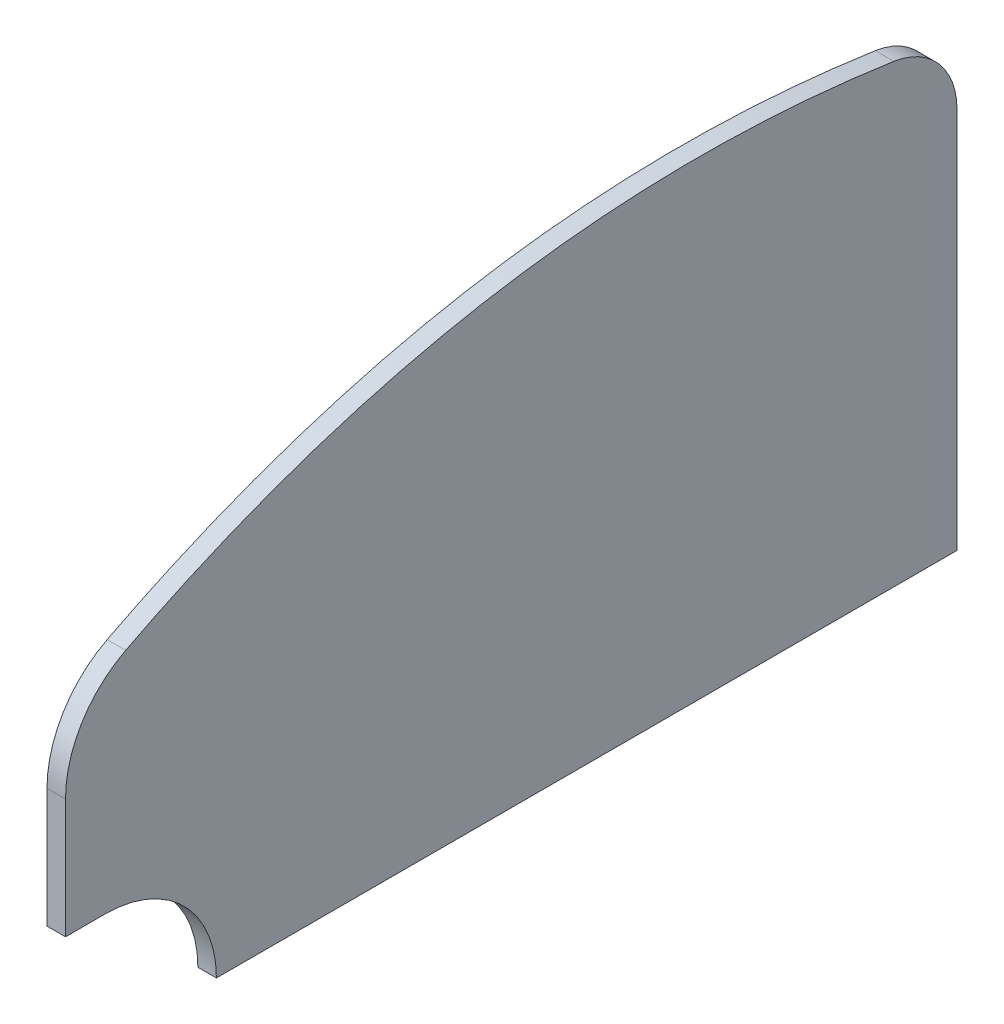
ISO-10303-21;
HEADER;
FILE_DESCRIPTION(('STEP AP214'),'2;1');
FILE_NAME('part.step','',(''),(''),'','','');
FILE_SCHEMA(('AUTOMOTIVE_DESIGN { 1 0 10303 214 1 1 1 1 }'));
ENDSEC;
DATA;
#1=APPLICATION_CONTEXT('core data for automotive mechanical design processes');
#2=APPLICATION_PROTOCOL_DEFINITION('international standard','automotive_design',2000,#1);
#3=PRODUCT_CONTEXT('',#1,'mechanical');
#4=PRODUCT('Part','Part','',(#3));
#5=PRODUCT_RELATED_PRODUCT_CATEGORY('part','',(#4));
#6=PRODUCT_DEFINITION_FORMATION('','',#4);
#7=PRODUCT_DEFINITION_CONTEXT('part definition',#1,'design');
#8=PRODUCT_DEFINITION('design','',#6,#7);
#9=PRODUCT_DEFINITION_SHAPE('','',#8);
#10=(LENGTH_UNIT() NAMED_UNIT(*) SI_UNIT(.MILLI.,.METRE.));
#11=(NAMED_UNIT(*) PLANE_ANGLE_UNIT() SI_UNIT($,.RADIAN.));
#12=(NAMED_UNIT(*) SI_UNIT($,.STERADIAN.) SOLID_ANGLE_UNIT());
#13=UNCERTAINTY_MEASURE_WITH_UNIT(LENGTH_MEASURE(1.E-05),#10,'distance_accuracy_value','');
#14=(GEOMETRIC_REPRESENTATION_CONTEXT(3) GLOBAL_UNCERTAINTY_ASSIGNED_CONTEXT((#13)) GLOBAL_UNIT_ASSIGNED_CONTEXT((#10,
#11,#12)) REPRESENTATION_CONTEXT('',''));
#15=CARTESIAN_POINT('',(0.,0.,0.));
#16=DIRECTION('',(0.,0.,1.));
#17=DIRECTION('',(1.,0.,0.));
#18=AXIS2_PLACEMENT_3D('',#15,#16,#17);
#19=CARTESIAN_POINT('',(12.7,202.565517241379,-552.210163248103));
#20=CARTESIAN_POINT('',(12.7,265.702079644609,-225.141214240864));
#21=CARTESIAN_POINT('',(12.7,100.965517241379,59.3103448275861));
#22=B_SPLINE_CURVE_WITH_KNOTS('',2,(#19,#20,#21),.UNSPECIFIED.,.F.,.F.,(3,3),(0.,1.),.UNSPECIFIED.);
#23=DIRECTION('',(-1.,0.,0.));
#24=VECTOR('',#23,1.);
#25=SURFACE_OF_LINEAR_EXTRUSION('',#22,#24);
#26=CARTESIAN_POINT('',(12.7,209.963001157048,-508.844165717423));
#27=VERTEX_POINT('',#26);
#28=CARTESIAN_POINT('',(12.7,123.552335287237,18.0391226451844));
#29=VERTEX_POINT('',#28);
#30=EDGE_CURVE('E109',#27,#29,#22,.T.);
#31=ORIENTED_EDGE('',*,*,#30,.F.);
#32=DIRECTION('',(-1.,0.,0.));
#33=VECTOR('',#32,1.);
#34=CARTESIAN_POINT('',(12.7,209.963001157048,-508.844165717423));
#35=LINE('',#34,#33);
#36=CARTESIAN_POINT('',(0.,209.963001157048,-508.844165717423));
#37=VERTEX_POINT('',#36);
#38=EDGE_CURVE('E164',#27,#37,#35,.T.);
#39=ORIENTED_EDGE('',*,*,#38,.T.);
#40=CARTESIAN_POINT('',(0.,202.565517241379,-552.210163248103));
#41=CARTESIAN_POINT('',(0.,265.702079644609,-225.141214240864));
#42=CARTESIAN_POINT('',(0.,100.965517241379,59.3103448275861));
#43=B_SPLINE_CURVE_WITH_KNOTS('',2,(#40,#41,#42),.UNSPECIFIED.,.F.,.F.,(3,3),(0.,1.),.UNSPECIFIED.);
#44=CARTESIAN_POINT('',(0.,123.552335287237,18.0391226451844));
#45=VERTEX_POINT('',#44);
#46=EDGE_CURVE('E134',#37,#45,#43,.T.);
#47=ORIENTED_EDGE('',*,*,#46,.T.);
#48=DIRECTION('',(-1.,0.,0.));
#49=VECTOR('',#48,1.);
#50=CARTESIAN_POINT('',(0.,123.552335287237,18.0391226451844));
#51=LINE('',#50,#49);
#52=EDGE_CURVE('E160',#45,#29,#51,.F.);
#53=ORIENTED_EDGE('',*,*,#52,.T.);
#54=EDGE_LOOP('',(#31,#39,#47,#53));
#55=FACE_BOUND('',#54,.T.);
#56=ADVANCED_FACE('F34',(#55),#25,.F.);
#57=CARTESIAN_POINT('',(12.7,100.965517241379,59.3103448275861));
#58=DIRECTION('',(0.,0.,-1.));
#59=DIRECTION('',(0.,1.,0.));
#60=AXIS2_PLACEMENT_3D('',#57,#58,#59);
#61=PLANE('',#60);
#62=DIRECTION('',(0.,-1.,0.));
#63=VECTOR('',#62,1.);
#64=CARTESIAN_POINT('',(12.7,100.965517241379,59.3103448275861));
#65=LINE('',#64,#63);
#66=CARTESIAN_POINT('',(12.7,55.8292189962032,59.3103448275861));
#67=VERTEX_POINT('',#66);
#68=CARTESIAN_POINT('',(12.7,-26.0344827586206,59.3103448275861));
#69=VERTEX_POINT('',#68);
#70=EDGE_CURVE('E98',#67,#69,#65,.T.);
#71=ORIENTED_EDGE('',*,*,#70,.F.);
#72=DIRECTION('',(-1.,0.,0.));
#73=VECTOR('',#72,1.);
#74=CARTESIAN_POINT('',(12.7,55.8292189962032,59.3103448275861));
#75=LINE('',#74,#73);
#76=CARTESIAN_POINT('',(0.,55.8292189962032,59.3103448275861));
#77=VERTEX_POINT('',#76);
#78=EDGE_CURVE('E118',#67,#77,#75,.T.);
#79=ORIENTED_EDGE('',*,*,#78,.T.);
#80=DIRECTION('',(0.,-1.,0.));
#81=VECTOR('',#80,1.);
#82=CARTESIAN_POINT('',(0.,100.965517241379,59.3103448275861));
#83=LINE('',#82,#81);
#84=CARTESIAN_POINT('',(0.,-26.0344827586206,59.3103448275861));
#85=VERTEX_POINT('',#84);
#86=EDGE_CURVE('E115',#77,#85,#83,.T.);
#87=ORIENTED_EDGE('',*,*,#86,.T.);
#88=DIRECTION('',(-1.,0.,0.));
#89=VECTOR('',#88,1.);
#90=CARTESIAN_POINT('',(12.7,-26.0344827586206,59.3103448275861));
#91=LINE('',#90,#89);
#92=EDGE_CURVE('E112',#69,#85,#91,.T.);
#93=ORIENTED_EDGE('',*,*,#92,.F.);
#94=EDGE_LOOP('',(#71,#79,#87,#93));
#95=FACE_BOUND('',#94,.T.);
#96=ADVANCED_FACE('F113',(#95),#61,.F.);
#97=CARTESIAN_POINT('',(12.7,-26.0344827586206,59.3103448275861));
#98=DIRECTION('',(0.,1.,0.));
#99=DIRECTION('',(0.,0.,1.));
#100=AXIS2_PLACEMENT_3D('',#97,#98,#99);
#101=PLANE('',#100);
#102=DIRECTION('',(0.,0.,-1.));
#103=VECTOR('',#102,1.);
#104=CARTESIAN_POINT('',(0.,-26.0344827586206,59.3103448275861));
#105=LINE('',#104,#103);
#106=CARTESIAN_POINT('',(0.,-26.0344827586206,31.9898367518973));
#107=VERTEX_POINT('',#106);
#108=EDGE_CURVE('E142',#85,#107,#105,.T.);
#109=ORIENTED_EDGE('',*,*,#108,.T.);
#110=DIRECTION('',(-1.,0.,0.));
#111=VECTOR('',#110,1.);
#112=CARTESIAN_POINT('',(12.7,-26.0344827586206,31.9898367518973));
#113=LINE('',#112,#111);
#114=CARTESIAN_POINT('',(12.7,-26.0344827586206,31.9898367518973));
#115=VERTEX_POINT('',#114);
#116=EDGE_CURVE('E119',#115,#107,#113,.T.);
#117=ORIENTED_EDGE('',*,*,#116,.F.);
#118=DIRECTION('',(0.,0.,-1.));
#119=VECTOR('',#118,1.);
#120=CARTESIAN_POINT('',(12.7,-26.0344827586206,59.3103448275861));
#121=LINE('',#120,#119);
#122=EDGE_CURVE('E102',#69,#115,#121,.T.);
#123=ORIENTED_EDGE('',*,*,#122,.F.);
#124=ORIENTED_EDGE('',*,*,#92,.T.);
#125=EDGE_LOOP('',(#109,#117,#123,#124));
#126=FACE_BOUND('',#125,.T.);
#127=ADVANCED_FACE('F121',(#126),#101,.F.);
#128=CARTESIAN_POINT('',(12.7,-102.234482758621,31.9898367518973));
#129=DIRECTION('',(-1.,0.,0.));
#130=DIRECTION('',(0.,0.,1.));
#131=AXIS2_PLACEMENT_3D('',#128,#129,#130);
#132=CYLINDRICAL_SURFACE('',#131,76.2);
#133=CARTESIAN_POINT('',(0.,-102.234482758621,31.9898367518973));
#134=DIRECTION('',(-1.,0.,0.));
#135=DIRECTION('',(0.,0.,1.));
#136=AXIS2_PLACEMENT_3D('',#133,#134,#135);
#137=CIRCLE('',#136,76.2);
#138=CARTESIAN_POINT('',(0.,-102.234482758621,-44.2101632481027));
#139=VERTEX_POINT('',#138);
#140=EDGE_CURVE('E144',#107,#139,#137,.T.);
#141=ORIENTED_EDGE('',*,*,#140,.T.);
#142=DIRECTION('',(-1.,0.,0.));
#143=VECTOR('',#142,1.);
#144=CARTESIAN_POINT('',(12.7,-102.234482758621,-44.2101632481027));
#145=LINE('',#144,#143);
#146=CARTESIAN_POINT('',(12.7,-102.234482758621,-44.2101632481027));
#147=VERTEX_POINT('',#146);
#148=EDGE_CURVE('E152',#147,#139,#145,.T.);
#149=ORIENTED_EDGE('',*,*,#148,.F.);
#150=CARTESIAN_POINT('',(12.7,-102.234482758621,31.9898367518973));
#151=DIRECTION('',(-1.,0.,0.));
#152=DIRECTION('',(0.,0.,1.));
#153=AXIS2_PLACEMENT_3D('',#150,#151,#152);
#154=CIRCLE('',#153,76.2);
#155=EDGE_CURVE('E124',#115,#147,#154,.T.);
#156=ORIENTED_EDGE('',*,*,#155,.F.);
#157=ORIENTED_EDGE('',*,*,#116,.T.);
#158=EDGE_LOOP('',(#141,#149,#156,#157));
#159=FACE_BOUND('',#158,.T.);
#160=ADVANCED_FACE('F204',(#159),#132,.F.);
#161=CARTESIAN_POINT('',(12.7,-102.234482758621,-44.2101632481027));
#162=DIRECTION('',(0.,1.,0.));
#163=DIRECTION('',(0.,0.,1.));
#164=AXIS2_PLACEMENT_3D('',#161,#162,#163);
#165=PLANE('',#164);
#166=DIRECTION('',(0.,0.,-1.));
#167=VECTOR('',#166,1.);
#168=CARTESIAN_POINT('',(0.,-102.234482758621,-44.2101632481027));
#169=LINE('',#168,#167);
#170=CARTESIAN_POINT('',(0.,-102.234482758621,-552.210163248103));
#171=VERTEX_POINT('',#170);
#172=EDGE_CURVE('E146',#139,#171,#169,.T.);
#173=ORIENTED_EDGE('',*,*,#172,.T.);
#174=DIRECTION('',(-1.,0.,0.));
#175=VECTOR('',#174,1.);
#176=CARTESIAN_POINT('',(12.7,-102.234482758621,-552.210163248103));
#177=LINE('',#176,#175);
#178=CARTESIAN_POINT('',(12.7,-102.234482758621,-552.210163248103));
#179=VERTEX_POINT('',#178);
#180=EDGE_CURVE('E133',#179,#171,#177,.T.);
#181=ORIENTED_EDGE('',*,*,#180,.F.);
#182=DIRECTION('',(0.,0.,-1.));
#183=VECTOR('',#182,1.);
#184=CARTESIAN_POINT('',(12.7,-102.234482758621,-44.2101632481027));
#185=LINE('',#184,#183);
#186=EDGE_CURVE('E126',#147,#179,#185,.T.);
#187=ORIENTED_EDGE('',*,*,#186,.F.);
#188=ORIENTED_EDGE('',*,*,#148,.T.);
#189=EDGE_LOOP('',(#173,#181,#187,#188));
#190=FACE_BOUND('',#189,.T.);
#191=ADVANCED_FACE('F201',(#190),#165,.F.);
#192=CARTESIAN_POINT('',(12.7,-102.234482758621,-552.210163248103));
#193=DIRECTION('',(0.,0.,1.));
#194=DIRECTION('',(1.,0.,0.));
#195=AXIS2_PLACEMENT_3D('',#192,#193,#194);
#196=PLANE('',#195);
#197=DIRECTION('',(0.,1.,0.));
#198=VECTOR('',#197,1.);
#199=CARTESIAN_POINT('',(0.,-102.234482758621,-552.210163248103));
#200=LINE('',#199,#198);
#201=CARTESIAN_POINT('',(0.,159.709885758238,-552.210163248103));
#202=VERTEX_POINT('',#201);
#203=EDGE_CURVE('E148',#171,#202,#200,.T.);
#204=ORIENTED_EDGE('',*,*,#203,.T.);
#205=DIRECTION('',(-1.,0.,0.));
#206=VECTOR('',#205,1.);
#207=CARTESIAN_POINT('',(12.7,159.709885758238,-552.210163248103));
#208=LINE('',#207,#206);
#209=CARTESIAN_POINT('',(12.7,159.709885758238,-552.210163248103));
#210=VERTEX_POINT('',#209);
#211=EDGE_CURVE('E42',#202,#210,#208,.F.);
#212=ORIENTED_EDGE('',*,*,#211,.T.);
#213=DIRECTION('',(0.,1.,0.));
#214=VECTOR('',#213,1.);
#215=CARTESIAN_POINT('',(12.7,-102.234482758621,-552.210163248103));
#216=LINE('',#215,#214);
#217=EDGE_CURVE('E131',#179,#210,#216,.T.);
#218=ORIENTED_EDGE('',*,*,#217,.F.);
#219=ORIENTED_EDGE('',*,*,#180,.T.);
#220=EDGE_LOOP('',(#204,#212,#218,#219));
#221=FACE_BOUND('',#220,.T.);
#222=ADVANCED_FACE('F197',(#221),#196,.F.);
#223=CARTESIAN_POINT('',(12.7,208.733798442994,-235.795561725561));
#224=DIRECTION('',(-1.,0.,0.));
#225=DIRECTION('',(0.,0.,1.));
#226=AXIS2_PLACEMENT_3D('',#223,#224,#225);
#227=PLANE('',#226);
#228=ORIENTED_EDGE('',*,*,#217,.T.);
#229=CARTESIAN_POINT('',(12.7,159.709885758238,-501.410163248103));
#230=DIRECTION('',(-1.,0.,0.));
#231=DIRECTION('',(0.,0.,1.));
#232=AXIS2_PLACEMENT_3D('',#229,#230,#231);
#233=CIRCLE('',#232,50.8);
#234=EDGE_CURVE('E11',#210,#27,#233,.F.);
#235=ORIENTED_EDGE('',*,*,#234,.T.);
#236=ORIENTED_EDGE('',*,*,#30,.T.);
#237=CARTESIAN_POINT('',(12.7,55.8292189962032,-16.889655172414));
#238=DIRECTION('',(-1.,0.,0.));
#239=DIRECTION('',(0.,0.,1.));
#240=AXIS2_PLACEMENT_3D('',#237,#238,#239);
#241=CIRCLE('',#240,76.2);
#242=EDGE_CURVE('E105',#29,#67,#241,.F.);
#243=ORIENTED_EDGE('',*,*,#242,.T.);
#244=ORIENTED_EDGE('',*,*,#70,.T.);
#245=ORIENTED_EDGE('',*,*,#122,.T.);
#246=ORIENTED_EDGE('',*,*,#155,.T.);
#247=ORIENTED_EDGE('',*,*,#186,.T.);
#248=EDGE_LOOP('',(#228,#235,#236,#243,#244,#245,#246,#247));
#249=FACE_BOUND('',#248,.T.);
#250=ADVANCED_FACE('F100',(#249),#227,.F.);
#251=CARTESIAN_POINT('',(0.,208.733798442994,-235.795561725561));
#252=DIRECTION('',(-1.,0.,0.));
#253=DIRECTION('',(0.,0.,1.));
#254=AXIS2_PLACEMENT_3D('',#251,#252,#253);
#255=PLANE('',#254);
#256=ORIENTED_EDGE('',*,*,#46,.F.);
#257=CARTESIAN_POINT('',(0.,159.709885758238,-501.410163248103));
#258=DIRECTION('',(-1.,0.,0.));
#259=DIRECTION('',(0.,0.,1.));
#260=AXIS2_PLACEMENT_3D('',#257,#258,#259);
#261=CIRCLE('',#260,50.8);
#262=EDGE_CURVE('E56',#37,#202,#261,.T.);
#263=ORIENTED_EDGE('',*,*,#262,.T.);
#264=ORIENTED_EDGE('',*,*,#203,.F.);
#265=ORIENTED_EDGE('',*,*,#172,.F.);
#266=ORIENTED_EDGE('',*,*,#140,.F.);
#267=ORIENTED_EDGE('',*,*,#108,.F.);
#268=ORIENTED_EDGE('',*,*,#86,.F.);
#269=CARTESIAN_POINT('',(0.,55.8292189962032,-16.889655172414));
#270=DIRECTION('',(-1.,0.,0.));
#271=DIRECTION('',(0.,0.,1.));
#272=AXIS2_PLACEMENT_3D('',#269,#270,#271);
#273=CIRCLE('',#272,76.2);
#274=EDGE_CURVE('E157',#77,#45,#273,.T.);
#275=ORIENTED_EDGE('',*,*,#274,.T.);
#276=EDGE_LOOP('',(#256,#263,#264,#265,#266,#267,#268,#275));
#277=FACE_BOUND('',#276,.T.);
#278=ADVANCED_FACE('F172',(#277),#255,.T.);
#279=CARTESIAN_POINT('',(6.35,55.8292189962032,-16.889655172414));
#280=DIRECTION('',(-1.,0.,0.));
#281=DIRECTION('',(0.,0.,1.));
#282=AXIS2_PLACEMENT_3D('',#279,#280,#281);
#283=CYLINDRICAL_SURFACE('',#282,76.2);
#284=ORIENTED_EDGE('',*,*,#242,.F.);
#285=ORIENTED_EDGE('',*,*,#52,.F.);
#286=ORIENTED_EDGE('',*,*,#274,.F.);
#287=ORIENTED_EDGE('',*,*,#78,.F.);
#288=EDGE_LOOP('',(#284,#285,#286,#287));
#289=FACE_BOUND('',#288,.T.);
#290=ADVANCED_FACE('F175',(#289),#283,.T.);
#291=CARTESIAN_POINT('',(6.35,159.709885758238,-501.410163248103));
#292=DIRECTION('',(-1.,0.,0.));
#293=DIRECTION('',(0.,0.,1.));
#294=AXIS2_PLACEMENT_3D('',#291,#292,#293);
#295=CYLINDRICAL_SURFACE('',#294,50.8);
#296=ORIENTED_EDGE('',*,*,#234,.F.);
#297=ORIENTED_EDGE('',*,*,#211,.F.);
#298=ORIENTED_EDGE('',*,*,#262,.F.);
#299=ORIENTED_EDGE('',*,*,#38,.F.);
#300=EDGE_LOOP('',(#296,#297,#298,#299));
#301=FACE_BOUND('',#300,.T.);
#302=ADVANCED_FACE('F36',(#301),#295,.T.);
#303=CLOSED_SHELL('',(#56,#96,#127,#160,#191,#222,#250,#278,#290,#302));
#304=MANIFOLD_SOLID_BREP('B2',#303);
#305=ADVANCED_BREP_SHAPE_REPRESENTATION('',(#18,#304),#14);
#306=SHAPE_DEFINITION_REPRESENTATION(#9,#305);
ENDSEC;
END-ISO-10303-21;
